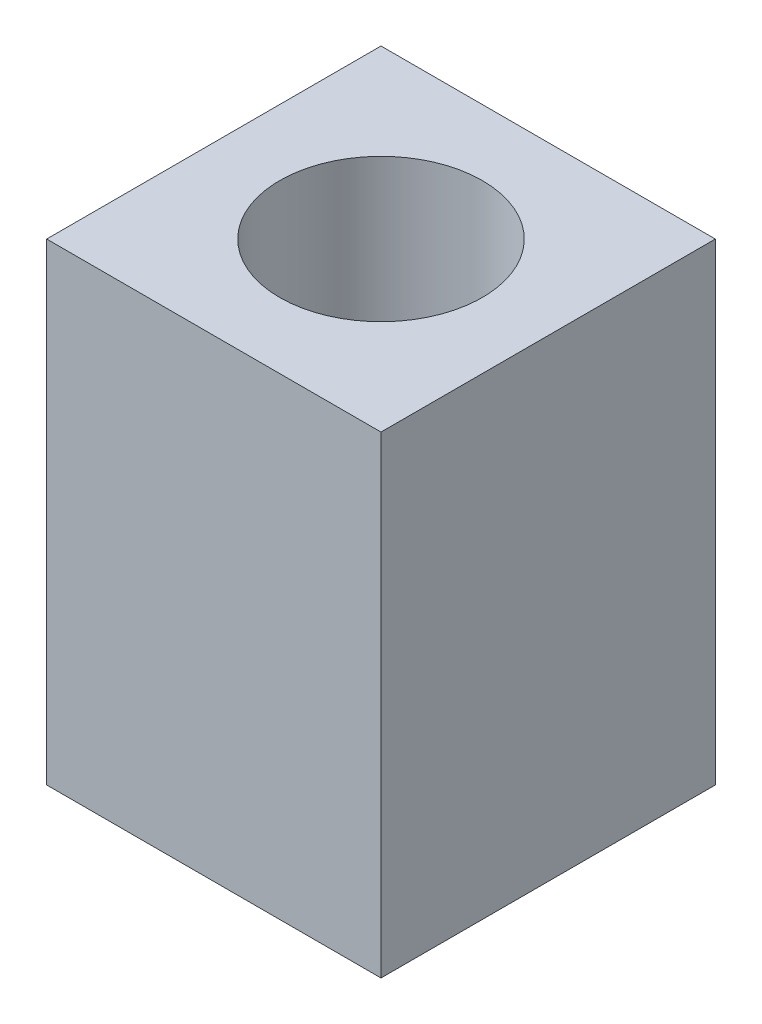
ISO-10303-21;
HEADER;
FILE_DESCRIPTION(('STEP AP214'),'2;1');
FILE_NAME('part.step','',(''),(''),'','','');
FILE_SCHEMA(('AUTOMOTIVE_DESIGN { 1 0 10303 214 1 1 1 1 }'));
ENDSEC;
DATA;
#1=APPLICATION_CONTEXT('core data for automotive mechanical design processes');
#2=APPLICATION_PROTOCOL_DEFINITION('international standard','automotive_design',2000,#1);
#3=PRODUCT_CONTEXT('',#1,'mechanical');
#4=PRODUCT('Part','Part','',(#3));
#5=PRODUCT_RELATED_PRODUCT_CATEGORY('part','',(#4));
#6=PRODUCT_DEFINITION_FORMATION('','',#4);
#7=PRODUCT_DEFINITION_CONTEXT('part definition',#1,'design');
#8=PRODUCT_DEFINITION('design','',#6,#7);
#9=PRODUCT_DEFINITION_SHAPE('','',#8);
#10=(LENGTH_UNIT() NAMED_UNIT(*) SI_UNIT(.MILLI.,.METRE.));
#11=(NAMED_UNIT(*) PLANE_ANGLE_UNIT() SI_UNIT($,.RADIAN.));
#12=(NAMED_UNIT(*) SI_UNIT($,.STERADIAN.) SOLID_ANGLE_UNIT());
#13=UNCERTAINTY_MEASURE_WITH_UNIT(LENGTH_MEASURE(1.E-05),#10,'distance_accuracy_value','');
#14=(GEOMETRIC_REPRESENTATION_CONTEXT(3) GLOBAL_UNCERTAINTY_ASSIGNED_CONTEXT((#13)) GLOBAL_UNIT_ASSIGNED_CONTEXT((#10,
#11,#12)) REPRESENTATION_CONTEXT('',''));
#15=CARTESIAN_POINT('',(0.,0.,0.));
#16=DIRECTION('',(0.,0.,1.));
#17=DIRECTION('',(1.,0.,0.));
#18=AXIS2_PLACEMENT_3D('',#15,#16,#17);
#19=CARTESIAN_POINT('',(0.,7.,0.));
#20=DIRECTION('',(0.,1.,0.));
#21=DIRECTION('',(0.,0.,1.));
#22=AXIS2_PLACEMENT_3D('',#19,#20,#21);
#23=PLANE('',#22);
#24=DIRECTION('',(0.,0.,-1.));
#25=VECTOR('',#24,1.);
#26=CARTESIAN_POINT('',(0.,7.,0.));
#27=LINE('',#26,#25);
#28=CARTESIAN_POINT('',(0.,7.,0.));
#29=VERTEX_POINT('',#28);
#30=CARTESIAN_POINT('',(0.,7.,-4.94974746830583));
#31=VERTEX_POINT('',#30);
#32=EDGE_CURVE('E85',#29,#31,#27,.T.);
#33=ORIENTED_EDGE('',*,*,#32,.T.);
#34=DIRECTION('',(-1.,0.,0.));
#35=VECTOR('',#34,1.);
#36=CARTESIAN_POINT('',(0.,7.,-4.94974746830583));
#37=LINE('',#36,#35);
#38=CARTESIAN_POINT('',(-4.94974746830583,7.,-4.94974746830583));
#39=VERTEX_POINT('',#38);
#40=EDGE_CURVE('E80',#31,#39,#37,.T.);
#41=ORIENTED_EDGE('',*,*,#40,.T.);
#42=DIRECTION('',(0.,0.,1.));
#43=VECTOR('',#42,1.);
#44=CARTESIAN_POINT('',(-4.94974746830583,7.,0.));
#45=LINE('',#44,#43);
#46=CARTESIAN_POINT('',(-4.94974746830583,7.,0.));
#47=VERTEX_POINT('',#46);
#48=EDGE_CURVE('E83',#39,#47,#45,.T.);
#49=ORIENTED_EDGE('',*,*,#48,.T.);
#50=DIRECTION('',(1.,0.,0.));
#51=VECTOR('',#50,1.);
#52=CARTESIAN_POINT('',(0.,7.,0.));
#53=LINE('',#52,#51);
#54=EDGE_CURVE('E50',#47,#29,#53,.T.);
#55=ORIENTED_EDGE('',*,*,#54,.T.);
#56=EDGE_LOOP('',(#33,#41,#49,#55));
#57=FACE_BOUND('',#56,.T.);
#58=CARTESIAN_POINT('',(-2.47487373415292,7.,-2.47487373415292));
#59=DIRECTION('',(0.,1.,0.));
#60=DIRECTION('',(0.,0.,1.));
#61=AXIS2_PLACEMENT_3D('',#58,#59,#60);
#62=CIRCLE('',#61,1.5);
#63=CARTESIAN_POINT('',(-2.47487373415292,7.,-0.974873734152916));
#64=VERTEX_POINT('',#63);
#65=EDGE_CURVE('E100',#64,#64,#62,.T.);
#66=ORIENTED_EDGE('',*,*,#65,.F.);
#67=EDGE_LOOP('',(#66));
#68=FACE_BOUND('',#67,.T.);
#69=ADVANCED_FACE('F33',(#57,#68),#23,.T.);
#70=CARTESIAN_POINT('',(0.,0.,0.));
#71=DIRECTION('',(0.,1.,0.));
#72=DIRECTION('',(0.,0.,1.));
#73=AXIS2_PLACEMENT_3D('',#70,#71,#72);
#74=PLANE('',#73);
#75=DIRECTION('',(0.,0.,-1.));
#76=VECTOR('',#75,1.);
#77=CARTESIAN_POINT('',(0.,0.,0.));
#78=LINE('',#77,#76);
#79=CARTESIAN_POINT('',(0.,0.,0.));
#80=VERTEX_POINT('',#79);
#81=CARTESIAN_POINT('',(0.,0.,-4.94974746830583));
#82=VERTEX_POINT('',#81);
#83=EDGE_CURVE('E97',#80,#82,#78,.T.);
#84=ORIENTED_EDGE('',*,*,#83,.F.);
#85=DIRECTION('',(1.,0.,0.));
#86=VECTOR('',#85,1.);
#87=CARTESIAN_POINT('',(0.,0.,0.));
#88=LINE('',#87,#86);
#89=CARTESIAN_POINT('',(-4.94974746830583,0.,0.));
#90=VERTEX_POINT('',#89);
#91=EDGE_CURVE('E73',#90,#80,#88,.T.);
#92=ORIENTED_EDGE('',*,*,#91,.F.);
#93=DIRECTION('',(0.,0.,1.));
#94=VECTOR('',#93,1.);
#95=CARTESIAN_POINT('',(-4.94974746830583,0.,0.));
#96=LINE('',#95,#94);
#97=CARTESIAN_POINT('',(-4.94974746830583,0.,-4.94974746830583));
#98=VERTEX_POINT('',#97);
#99=EDGE_CURVE('E67',#98,#90,#96,.T.);
#100=ORIENTED_EDGE('',*,*,#99,.F.);
#101=DIRECTION('',(-1.,0.,0.));
#102=VECTOR('',#101,1.);
#103=CARTESIAN_POINT('',(0.,0.,-4.94974746830583));
#104=LINE('',#103,#102);
#105=EDGE_CURVE('E89',#82,#98,#104,.T.);
#106=ORIENTED_EDGE('',*,*,#105,.F.);
#107=EDGE_LOOP('',(#84,#92,#100,#106));
#108=FACE_BOUND('',#107,.T.);
#109=CARTESIAN_POINT('',(-2.47487373415292,0.,-2.47487373415292));
#110=DIRECTION('',(0.,1.,0.));
#111=DIRECTION('',(0.,0.,1.));
#112=AXIS2_PLACEMENT_3D('',#109,#110,#111);
#113=CIRCLE('',#112,1.5);
#114=CARTESIAN_POINT('',(-2.47487373415292,0.,-0.974873734152916));
#115=VERTEX_POINT('',#114);
#116=EDGE_CURVE('E112',#115,#115,#113,.T.);
#117=ORIENTED_EDGE('',*,*,#116,.T.);
#118=EDGE_LOOP('',(#117));
#119=FACE_BOUND('',#118,.T.);
#120=ADVANCED_FACE('F108',(#108,#119),#74,.F.);
#121=CARTESIAN_POINT('',(0.,7.,0.));
#122=DIRECTION('',(-1.,0.,0.));
#123=DIRECTION('',(0.,0.,1.));
#124=AXIS2_PLACEMENT_3D('',#121,#122,#123);
#125=PLANE('',#124);
#126=ORIENTED_EDGE('',*,*,#83,.T.);
#127=DIRECTION('',(0.,-1.,0.));
#128=VECTOR('',#127,1.);
#129=CARTESIAN_POINT('',(0.,7.,-4.94974746830583));
#130=LINE('',#129,#128);
#131=EDGE_CURVE('E11',#31,#82,#130,.T.);
#132=ORIENTED_EDGE('',*,*,#131,.F.);
#133=ORIENTED_EDGE('',*,*,#32,.F.);
#134=DIRECTION('',(0.,-1.,0.));
#135=VECTOR('',#134,1.);
#136=CARTESIAN_POINT('',(0.,7.,0.));
#137=LINE('',#136,#135);
#138=EDGE_CURVE('E93',#29,#80,#137,.T.);
#139=ORIENTED_EDGE('',*,*,#138,.T.);
#140=EDGE_LOOP('',(#126,#132,#133,#139));
#141=FACE_BOUND('',#140,.T.);
#142=ADVANCED_FACE('F35',(#141),#125,.F.);
#143=CARTESIAN_POINT('',(0.,7.,-4.94974746830583));
#144=DIRECTION('',(0.,0.,1.));
#145=DIRECTION('',(1.,0.,0.));
#146=AXIS2_PLACEMENT_3D('',#143,#144,#145);
#147=PLANE('',#146);
#148=ORIENTED_EDGE('',*,*,#105,.T.);
#149=DIRECTION('',(0.,-1.,0.));
#150=VECTOR('',#149,1.);
#151=CARTESIAN_POINT('',(-4.94974746830583,7.,-4.94974746830583));
#152=LINE('',#151,#150);
#153=EDGE_CURVE('E42',#39,#98,#152,.T.);
#154=ORIENTED_EDGE('',*,*,#153,.F.);
#155=ORIENTED_EDGE('',*,*,#40,.F.);
#156=ORIENTED_EDGE('',*,*,#131,.T.);
#157=EDGE_LOOP('',(#148,#154,#155,#156));
#158=FACE_BOUND('',#157,.T.);
#159=ADVANCED_FACE('F88',(#158),#147,.F.);
#160=CARTESIAN_POINT('',(-4.94974746830583,7.,0.));
#161=DIRECTION('',(1.,0.,0.));
#162=DIRECTION('',(0.,0.,-1.));
#163=AXIS2_PLACEMENT_3D('',#160,#161,#162);
#164=PLANE('',#163);
#165=ORIENTED_EDGE('',*,*,#99,.T.);
#166=DIRECTION('',(0.,-1.,0.));
#167=VECTOR('',#166,1.);
#168=CARTESIAN_POINT('',(-4.94974746830583,7.,0.));
#169=LINE('',#168,#167);
#170=EDGE_CURVE('E90',#47,#90,#169,.T.);
#171=ORIENTED_EDGE('',*,*,#170,.F.);
#172=ORIENTED_EDGE('',*,*,#48,.F.);
#173=ORIENTED_EDGE('',*,*,#153,.T.);
#174=EDGE_LOOP('',(#165,#171,#172,#173));
#175=FACE_BOUND('',#174,.T.);
#176=ADVANCED_FACE('F91',(#175),#164,.F.);
#177=CARTESIAN_POINT('',(0.,7.,0.));
#178=DIRECTION('',(0.,0.,-1.));
#179=DIRECTION('',(-1.,0.,0.));
#180=AXIS2_PLACEMENT_3D('',#177,#178,#179);
#181=PLANE('',#180);
#182=ORIENTED_EDGE('',*,*,#91,.T.);
#183=ORIENTED_EDGE('',*,*,#138,.F.);
#184=ORIENTED_EDGE('',*,*,#54,.F.);
#185=ORIENTED_EDGE('',*,*,#170,.T.);
#186=EDGE_LOOP('',(#182,#183,#184,#185));
#187=FACE_BOUND('',#186,.T.);
#188=ADVANCED_FACE('F105',(#187),#181,.F.);
#189=CARTESIAN_POINT('',(-2.47487373415292,7.,-2.47487373415292));
#190=DIRECTION('',(0.,-1.,0.));
#191=DIRECTION('',(0.,0.,-1.));
#192=AXIS2_PLACEMENT_3D('',#189,#190,#191);
#193=CYLINDRICAL_SURFACE('',#192,1.5);
#194=ORIENTED_EDGE('',*,*,#65,.T.);
#195=EDGE_LOOP('',(#194));
#196=FACE_BOUND('',#195,.T.);
#197=ORIENTED_EDGE('',*,*,#116,.F.);
#198=EDGE_LOOP('',(#197));
#199=FACE_BOUND('',#198,.T.);
#200=ADVANCED_FACE('F118',(#196,#199),#193,.F.);
#201=CLOSED_SHELL('',(#69,#120,#142,#159,#176,#188,#200));
#202=MANIFOLD_SOLID_BREP('B2',#201);
#203=ADVANCED_BREP_SHAPE_REPRESENTATION('',(#18,#202),#14);
#204=SHAPE_DEFINITION_REPRESENTATION(#9,#203);
ENDSEC;
END-ISO-10303-21;
